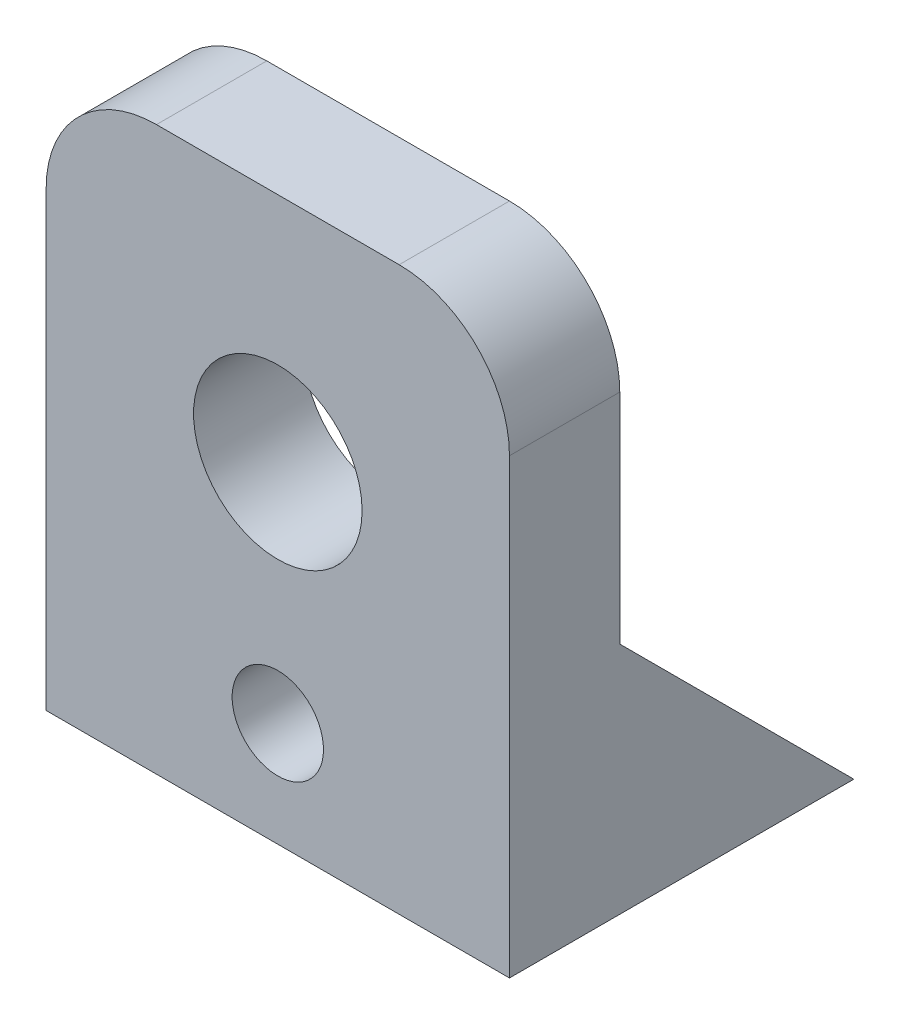
ISO-10303-21;
HEADER;
FILE_DESCRIPTION(('STEP AP214'),'2;1');
FILE_NAME('part.step','',(''),(''),'','','');
FILE_SCHEMA(('AUTOMOTIVE_DESIGN { 1 0 10303 214 1 1 1 1 }'));
ENDSEC;
DATA;
#1=APPLICATION_CONTEXT('core data for automotive mechanical design processes');
#2=APPLICATION_PROTOCOL_DEFINITION('international standard','automotive_design',2000,#1);
#3=PRODUCT_CONTEXT('',#1,'mechanical');
#4=PRODUCT('Part','Part','',(#3));
#5=PRODUCT_RELATED_PRODUCT_CATEGORY('part','',(#4));
#6=PRODUCT_DEFINITION_FORMATION('','',#4);
#7=PRODUCT_DEFINITION_CONTEXT('part definition',#1,'design');
#8=PRODUCT_DEFINITION('design','',#6,#7);
#9=PRODUCT_DEFINITION_SHAPE('','',#8);
#10=(LENGTH_UNIT() NAMED_UNIT(*) SI_UNIT(.MILLI.,.METRE.));
#11=(NAMED_UNIT(*) PLANE_ANGLE_UNIT() SI_UNIT($,.RADIAN.));
#12=(NAMED_UNIT(*) SI_UNIT($,.STERADIAN.) SOLID_ANGLE_UNIT());
#13=UNCERTAINTY_MEASURE_WITH_UNIT(LENGTH_MEASURE(1.E-05),#10,'distance_accuracy_value','');
#14=(GEOMETRIC_REPRESENTATION_CONTEXT(3) GLOBAL_UNCERTAINTY_ASSIGNED_CONTEXT((#13)) GLOBAL_UNIT_ASSIGNED_CONTEXT((#10,
#11,#12)) REPRESENTATION_CONTEXT('',''));
#15=CARTESIAN_POINT('',(0.,0.,0.));
#16=DIRECTION('',(0.,0.,1.));
#17=DIRECTION('',(1.,0.,0.));
#18=AXIS2_PLACEMENT_3D('',#15,#16,#17);
#19=CARTESIAN_POINT('',(-7.44489648097042,20.4806525942305,-10.));
#20=DIRECTION('',(0.,0.,1.));
#21=DIRECTION('',(1.,0.,0.));
#22=AXIS2_PLACEMENT_3D('',#19,#20,#21);
#23=PLANE('',#22);
#24=CARTESIAN_POINT('',(-18.4448964809706,-11.0193474057693,-10.));
#25=DIRECTION('',(0.,0.,1.));
#26=DIRECTION('',(1.,0.,0.));
#27=AXIS2_PLACEMENT_3D('',#24,#25,#26);
#28=CIRCLE('',#27,4.14);
#29=CARTESIAN_POINT('',(-14.3048964809706,-11.0193474057693,-10.));
#30=VERTEX_POINT('',#29);
#31=EDGE_CURVE('E126',#30,#30,#28,.T.);
#32=ORIENTED_EDGE('',*,*,#31,.T.);
#33=EDGE_LOOP('',(#32));
#34=FACE_BOUND('',#33,.T.);
#35=CARTESIAN_POINT('',(-18.4448964809706,9.48065259423065,-10.));
#36=DIRECTION('',(0.,0.,1.));
#37=DIRECTION('',(1.,0.,0.));
#38=AXIS2_PLACEMENT_3D('',#35,#36,#37);
#39=CIRCLE('',#38,7.64);
#40=CARTESIAN_POINT('',(-10.8048964809706,9.48065259423065,-10.));
#41=VERTEX_POINT('',#40);
#42=EDGE_CURVE('E120',#41,#41,#39,.T.);
#43=ORIENTED_EDGE('',*,*,#42,.T.);
#44=EDGE_LOOP('',(#43));
#45=FACE_BOUND('',#44,.T.);
#46=DIRECTION('',(1.,0.,0.));
#47=VECTOR('',#46,1.);
#48=CARTESIAN_POINT('',(-7.44489648097035,0.698211879724428,-10.));
#49=LINE('',#48,#47);
#50=CARTESIAN_POINT('',(-7.44489648097035,0.698211879724428,-10.));
#51=VERTEX_POINT('',#50);
#52=CARTESIAN_POINT('',(2.55510351902965,0.698211879724447,-10.));
#53=VERTEX_POINT('',#52);
#54=EDGE_CURVE('E97',#51,#53,#49,.T.);
#55=ORIENTED_EDGE('',*,*,#54,.F.);
#56=DIRECTION('',(0.,1.,0.));
#57=VECTOR('',#56,1.);
#58=CARTESIAN_POINT('',(-7.44489648097027,-20.5193474057695,-10.));
#59=LINE('',#58,#57);
#60=CARTESIAN_POINT('',(-7.44489648097031,-20.5193474057695,-10.));
#61=VERTEX_POINT('',#60);
#62=EDGE_CURVE('E56',#61,#51,#59,.T.);
#63=ORIENTED_EDGE('',*,*,#62,.F.);
#64=DIRECTION('',(1.,0.,0.));
#65=VECTOR('',#64,1.);
#66=CARTESIAN_POINT('',(-39.4448964809703,-20.5193474057695,-10.));
#67=LINE('',#66,#65);
#68=CARTESIAN_POINT('',(-39.4448964809703,-20.5193474057695,-10.));
#69=VERTEX_POINT('',#68);
#70=EDGE_CURVE('E132',#69,#61,#67,.T.);
#71=ORIENTED_EDGE('',*,*,#70,.F.);
#72=DIRECTION('',(0.,-1.,0.));
#73=VECTOR('',#72,1.);
#74=CARTESIAN_POINT('',(-39.4448964809704,20.4806525942305,-10.));
#75=LINE('',#74,#73);
#76=CARTESIAN_POINT('',(-39.4448964809704,20.4806525942305,-10.));
#77=VERTEX_POINT('',#76);
#78=EDGE_CURVE('E145',#77,#69,#75,.T.);
#79=ORIENTED_EDGE('',*,*,#78,.F.);
#80=CARTESIAN_POINT('',(-29.4448964809704,20.4806525942305,-10.));
#81=DIRECTION('',(0.,0.,1.));
#82=DIRECTION('',(-1.,0.,0.));
#83=AXIS2_PLACEMENT_3D('',#80,#81,#82);
#84=CIRCLE('',#83,10.);
#85=CARTESIAN_POINT('',(-29.4448964809704,30.4806525942305,-10.));
#86=VERTEX_POINT('',#85);
#87=EDGE_CURVE('E142',#86,#77,#84,.T.);
#88=ORIENTED_EDGE('',*,*,#87,.F.);
#89=DIRECTION('',(-1.,0.,0.));
#90=VECTOR('',#89,1.);
#91=CARTESIAN_POINT('',(-7.44489648097042,30.4806525942305,-10.));
#92=LINE('',#91,#90);
#93=CARTESIAN_POINT('',(-7.44489648097042,30.4806525942305,-10.));
#94=VERTEX_POINT('',#93);
#95=EDGE_CURVE('E139',#94,#86,#92,.T.);
#96=ORIENTED_EDGE('',*,*,#95,.F.);
#97=CARTESIAN_POINT('',(-7.44489648097042,20.4806525942305,-10.));
#98=DIRECTION('',(0.,0.,1.));
#99=DIRECTION('',(1.,0.,0.));
#100=AXIS2_PLACEMENT_3D('',#97,#98,#99);
#101=CIRCLE('',#100,10.);
#102=CARTESIAN_POINT('',(2.55510351902959,20.4806525942305,-10.));
#103=VERTEX_POINT('',#102);
#104=EDGE_CURVE('E136',#103,#94,#101,.T.);
#105=ORIENTED_EDGE('',*,*,#104,.F.);
#106=DIRECTION('',(0.,1.,0.));
#107=VECTOR('',#106,1.);
#108=CARTESIAN_POINT('',(2.55510351902973,-20.5193474057695,-10.));
#109=LINE('',#108,#107);
#110=EDGE_CURVE('E50',#53,#103,#109,.T.);
#111=ORIENTED_EDGE('',*,*,#110,.F.);
#112=EDGE_LOOP('',(#55,#63,#71,#79,#88,#96,#105,#111));
#113=FACE_BOUND('',#112,.T.);
#114=ADVANCED_FACE('F33',(#34,#45,#113),#23,.F.);
#115=CARTESIAN_POINT('',(-39.4448964809703,-20.5193474057695,-10.));
#116=DIRECTION('',(0.,-1.,0.));
#117=DIRECTION('',(0.,0.,-1.));
#118=AXIS2_PLACEMENT_3D('',#115,#116,#117);
#119=PLANE('',#118);
#120=DIRECTION('',(1.,0.,0.));
#121=VECTOR('',#120,1.);
#122=CARTESIAN_POINT('',(-39.4448964809703,-20.5193474057695,0.));
#123=LINE('',#122,#121);
#124=CARTESIAN_POINT('',(-39.4448964809703,-20.5193474057695,0.));
#125=VERTEX_POINT('',#124);
#126=CARTESIAN_POINT('',(2.55510351902973,-20.5193474057695,0.));
#127=VERTEX_POINT('',#126);
#128=EDGE_CURVE('E129',#125,#127,#123,.T.);
#129=ORIENTED_EDGE('',*,*,#128,.F.);
#130=DIRECTION('',(0.,0.,1.));
#131=VECTOR('',#130,1.);
#132=CARTESIAN_POINT('',(-39.4448964809703,-20.5193474057695,-10.));
#133=LINE('',#132,#131);
#134=EDGE_CURVE('E11',#69,#125,#133,.T.);
#135=ORIENTED_EDGE('',*,*,#134,.F.);
#136=ORIENTED_EDGE('',*,*,#70,.T.);
#137=DIRECTION('',(0.,0.,1.));
#138=VECTOR('',#137,1.);
#139=CARTESIAN_POINT('',(-7.44489648097027,-20.5193474057695,-31.2175592854942));
#140=LINE('',#139,#138);
#141=CARTESIAN_POINT('',(-7.44489648097027,-20.5193474057695,-31.2175592854942));
#142=VERTEX_POINT('',#141);
#143=EDGE_CURVE('E111',#142,#61,#140,.T.);
#144=ORIENTED_EDGE('',*,*,#143,.F.);
#145=DIRECTION('',(1.,0.,0.));
#146=VECTOR('',#145,1.);
#147=CARTESIAN_POINT('',(-7.44489648097027,-20.5193474057695,-31.2175592854942));
#148=LINE('',#147,#146);
#149=CARTESIAN_POINT('',(2.55510351902973,-20.5193474057695,-31.2175592854942));
#150=VERTEX_POINT('',#149);
#151=EDGE_CURVE('E102',#142,#150,#148,.T.);
#152=ORIENTED_EDGE('',*,*,#151,.T.);
#153=DIRECTION('',(0.,0.,1.));
#154=VECTOR('',#153,1.);
#155=CARTESIAN_POINT('',(2.55510351902973,-20.5193474057695,-10.));
#156=LINE('',#155,#154);
#157=EDGE_CURVE('E37',#150,#127,#156,.T.);
#158=ORIENTED_EDGE('',*,*,#157,.T.);
#159=EDGE_LOOP('',(#129,#135,#136,#144,#152,#158));
#160=FACE_BOUND('',#159,.T.);
#161=ADVANCED_FACE('F35',(#160),#119,.T.);
#162=CARTESIAN_POINT('',(-39.4448964809704,20.4806525942305,-10.));
#163=DIRECTION('',(-1.,0.,0.));
#164=DIRECTION('',(0.,-1.,0.));
#165=AXIS2_PLACEMENT_3D('',#162,#163,#164);
#166=PLANE('',#165);
#167=DIRECTION('',(0.,-1.,0.));
#168=VECTOR('',#167,1.);
#169=CARTESIAN_POINT('',(-39.4448964809704,20.4806525942305,0.));
#170=LINE('',#169,#168);
#171=CARTESIAN_POINT('',(-39.4448964809704,20.4806525942305,0.));
#172=VERTEX_POINT('',#171);
#173=EDGE_CURVE('E134',#172,#125,#170,.T.);
#174=ORIENTED_EDGE('',*,*,#173,.F.);
#175=DIRECTION('',(0.,0.,1.));
#176=VECTOR('',#175,1.);
#177=CARTESIAN_POINT('',(-39.4448964809704,20.4806525942305,-10.));
#178=LINE('',#177,#176);
#179=EDGE_CURVE('E42',#77,#172,#178,.T.);
#180=ORIENTED_EDGE('',*,*,#179,.F.);
#181=ORIENTED_EDGE('',*,*,#78,.T.);
#182=ORIENTED_EDGE('',*,*,#134,.T.);
#183=EDGE_LOOP('',(#174,#180,#181,#182));
#184=FACE_BOUND('',#183,.T.);
#185=ADVANCED_FACE('F181',(#184),#166,.T.);
#186=CARTESIAN_POINT('',(-29.4448964809704,20.4806525942305,-10.));
#187=DIRECTION('',(0.,0.,1.));
#188=DIRECTION('',(1.,0.,0.));
#189=AXIS2_PLACEMENT_3D('',#186,#187,#188);
#190=CYLINDRICAL_SURFACE('',#189,10.);
#191=CARTESIAN_POINT('',(-29.4448964809704,20.4806525942305,0.));
#192=DIRECTION('',(0.,0.,1.));
#193=DIRECTION('',(-1.,0.,0.));
#194=AXIS2_PLACEMENT_3D('',#191,#192,#193);
#195=CIRCLE('',#194,10.);
#196=CARTESIAN_POINT('',(-29.4448964809704,30.4806525942305,0.));
#197=VERTEX_POINT('',#196);
#198=EDGE_CURVE('E159',#197,#172,#195,.T.);
#199=ORIENTED_EDGE('',*,*,#198,.F.);
#200=DIRECTION('',(0.,0.,1.));
#201=VECTOR('',#200,1.);
#202=CARTESIAN_POINT('',(-29.4448964809704,30.4806525942305,-10.));
#203=LINE('',#202,#201);
#204=EDGE_CURVE('E165',#86,#197,#203,.T.);
#205=ORIENTED_EDGE('',*,*,#204,.F.);
#206=ORIENTED_EDGE('',*,*,#87,.T.);
#207=ORIENTED_EDGE('',*,*,#179,.T.);
#208=EDGE_LOOP('',(#199,#205,#206,#207));
#209=FACE_BOUND('',#208,.T.);
#210=ADVANCED_FACE('F198',(#209),#190,.T.);
#211=CARTESIAN_POINT('',(-7.44489648097042,30.4806525942305,-10.));
#212=DIRECTION('',(0.,1.,0.));
#213=DIRECTION('',(0.,0.,1.));
#214=AXIS2_PLACEMENT_3D('',#211,#212,#213);
#215=PLANE('',#214);
#216=DIRECTION('',(-1.,0.,0.));
#217=VECTOR('',#216,1.);
#218=CARTESIAN_POINT('',(-7.44489648097042,30.4806525942305,0.));
#219=LINE('',#218,#217);
#220=CARTESIAN_POINT('',(-7.44489648097042,30.4806525942305,0.));
#221=VERTEX_POINT('',#220);
#222=EDGE_CURVE('E156',#221,#197,#219,.T.);
#223=ORIENTED_EDGE('',*,*,#222,.F.);
#224=DIRECTION('',(0.,0.,1.));
#225=VECTOR('',#224,1.);
#226=CARTESIAN_POINT('',(-7.44489648097042,30.4806525942305,-10.));
#227=LINE('',#226,#225);
#228=EDGE_CURVE('E167',#94,#221,#227,.T.);
#229=ORIENTED_EDGE('',*,*,#228,.F.);
#230=ORIENTED_EDGE('',*,*,#95,.T.);
#231=ORIENTED_EDGE('',*,*,#204,.T.);
#232=EDGE_LOOP('',(#223,#229,#230,#231));
#233=FACE_BOUND('',#232,.T.);
#234=ADVANCED_FACE('F188',(#233),#215,.T.);
#235=CARTESIAN_POINT('',(-7.44489648097042,20.4806525942305,-10.));
#236=DIRECTION('',(0.,0.,1.));
#237=DIRECTION('',(1.,0.,0.));
#238=AXIS2_PLACEMENT_3D('',#235,#236,#237);
#239=CYLINDRICAL_SURFACE('',#238,10.);
#240=CARTESIAN_POINT('',(-7.44489648097042,20.4806525942305,0.));
#241=DIRECTION('',(0.,0.,1.));
#242=DIRECTION('',(1.,0.,0.));
#243=AXIS2_PLACEMENT_3D('',#240,#241,#242);
#244=CIRCLE('',#243,10.);
#245=CARTESIAN_POINT('',(2.55510351902959,20.4806525942305,0.));
#246=VERTEX_POINT('',#245);
#247=EDGE_CURVE('E153',#246,#221,#244,.T.);
#248=ORIENTED_EDGE('',*,*,#247,.F.);
#249=DIRECTION('',(0.,0.,1.));
#250=VECTOR('',#249,1.);
#251=CARTESIAN_POINT('',(2.55510351902959,20.4806525942305,-10.));
#252=LINE('',#251,#250);
#253=EDGE_CURVE('E168',#103,#246,#252,.T.);
#254=ORIENTED_EDGE('',*,*,#253,.F.);
#255=ORIENTED_EDGE('',*,*,#104,.T.);
#256=ORIENTED_EDGE('',*,*,#228,.T.);
#257=EDGE_LOOP('',(#248,#254,#255,#256));
#258=FACE_BOUND('',#257,.T.);
#259=ADVANCED_FACE('F190',(#258),#239,.T.);
#260=CARTESIAN_POINT('',(2.55510351902973,-20.5193474057695,-10.));
#261=DIRECTION('',(1.,0.,0.));
#262=DIRECTION('',(0.,1.,0.));
#263=AXIS2_PLACEMENT_3D('',#260,#261,#262);
#264=PLANE('',#263);
#265=DIRECTION('',(0.,1.,0.));
#266=VECTOR('',#265,1.);
#267=CARTESIAN_POINT('',(2.55510351902973,-20.5193474057695,0.));
#268=LINE('',#267,#266);
#269=EDGE_CURVE('E150',#127,#246,#268,.T.);
#270=ORIENTED_EDGE('',*,*,#269,.F.);
#271=ORIENTED_EDGE('',*,*,#157,.F.);
#272=DIRECTION('',(0.,-0.707106781186544,-0.707106781186551));
#273=VECTOR('',#272,1.);
#274=CARTESIAN_POINT('',(2.55510351902965,0.698211879724462,-10.));
#275=LINE('',#274,#273);
#276=EDGE_CURVE('E114',#53,#150,#275,.T.);
#277=ORIENTED_EDGE('',*,*,#276,.F.);
#278=ORIENTED_EDGE('',*,*,#110,.T.);
#279=ORIENTED_EDGE('',*,*,#253,.T.);
#280=EDGE_LOOP('',(#270,#271,#277,#278,#279));
#281=FACE_BOUND('',#280,.T.);
#282=ADVANCED_FACE('F175',(#281),#264,.T.);
#283=CARTESIAN_POINT('',(-7.44489648097042,20.4806525942305,0.));
#284=DIRECTION('',(0.,0.,1.));
#285=DIRECTION('',(1.,0.,0.));
#286=AXIS2_PLACEMENT_3D('',#283,#284,#285);
#287=PLANE('',#286);
#288=CARTESIAN_POINT('',(-18.4448964809706,9.48065259423065,0.));
#289=DIRECTION('',(0.,0.,1.));
#290=DIRECTION('',(1.,0.,0.));
#291=AXIS2_PLACEMENT_3D('',#288,#289,#290);
#292=CIRCLE('',#291,7.64);
#293=CARTESIAN_POINT('',(-10.8048964809706,9.48065259423065,0.));
#294=VERTEX_POINT('',#293);
#295=EDGE_CURVE('E101',#294,#294,#292,.T.);
#296=ORIENTED_EDGE('',*,*,#295,.F.);
#297=EDGE_LOOP('',(#296));
#298=FACE_BOUND('',#297,.T.);
#299=CARTESIAN_POINT('',(-18.4448964809706,-11.0193474057693,0.));
#300=DIRECTION('',(0.,0.,1.));
#301=DIRECTION('',(1.,0.,0.));
#302=AXIS2_PLACEMENT_3D('',#299,#300,#301);
#303=CIRCLE('',#302,4.14);
#304=CARTESIAN_POINT('',(-14.3048964809706,-11.0193474057693,0.));
#305=VERTEX_POINT('',#304);
#306=EDGE_CURVE('E123',#305,#305,#303,.T.);
#307=ORIENTED_EDGE('',*,*,#306,.F.);
#308=EDGE_LOOP('',(#307));
#309=FACE_BOUND('',#308,.T.);
#310=ORIENTED_EDGE('',*,*,#128,.T.);
#311=ORIENTED_EDGE('',*,*,#269,.T.);
#312=ORIENTED_EDGE('',*,*,#247,.T.);
#313=ORIENTED_EDGE('',*,*,#222,.T.);
#314=ORIENTED_EDGE('',*,*,#198,.T.);
#315=ORIENTED_EDGE('',*,*,#173,.T.);
#316=EDGE_LOOP('',(#310,#311,#312,#313,#314,#315));
#317=FACE_BOUND('',#316,.T.);
#318=ADVANCED_FACE('F177',(#298,#309,#317),#287,.T.);
#319=CARTESIAN_POINT('',(-18.4448964809706,-11.0193474057693,-10.));
#320=DIRECTION('',(0.,0.,1.));
#321=DIRECTION('',(1.,0.,0.));
#322=AXIS2_PLACEMENT_3D('',#319,#320,#321);
#323=CYLINDRICAL_SURFACE('',#322,4.14);
#324=ORIENTED_EDGE('',*,*,#31,.F.);
#325=EDGE_LOOP('',(#324));
#326=FACE_BOUND('',#325,.T.);
#327=ORIENTED_EDGE('',*,*,#306,.T.);
#328=EDGE_LOOP('',(#327));
#329=FACE_BOUND('',#328,.T.);
#330=ADVANCED_FACE('F211',(#326,#329),#323,.F.);
#331=CARTESIAN_POINT('',(-18.4448964809706,9.48065259423065,-10.));
#332=DIRECTION('',(0.,0.,1.));
#333=DIRECTION('',(1.,0.,0.));
#334=AXIS2_PLACEMENT_3D('',#331,#332,#333);
#335=CYLINDRICAL_SURFACE('',#334,7.64);
#336=ORIENTED_EDGE('',*,*,#42,.F.);
#337=EDGE_LOOP('',(#336));
#338=FACE_BOUND('',#337,.T.);
#339=ORIENTED_EDGE('',*,*,#295,.T.);
#340=EDGE_LOOP('',(#339));
#341=FACE_BOUND('',#340,.T.);
#342=ADVANCED_FACE('F245',(#338,#341),#335,.F.);
#343=CARTESIAN_POINT('',(-7.44489648097035,0.698211879724428,-10.));
#344=DIRECTION('',(0.,-0.707106781186551,0.707106781186544));
#345=DIRECTION('',(0.,-0.707106781186544,-0.707106781186551));
#346=AXIS2_PLACEMENT_3D('',#343,#344,#345);
#347=PLANE('',#346);
#348=ORIENTED_EDGE('',*,*,#276,.T.);
#349=ORIENTED_EDGE('',*,*,#151,.F.);
#350=DIRECTION('',(0.,-0.707106781186544,-0.707106781186551));
#351=VECTOR('',#350,1.);
#352=CARTESIAN_POINT('',(-7.44489648097035,0.698211879724428,-10.));
#353=LINE('',#352,#351);
#354=EDGE_CURVE('E105',#51,#142,#353,.T.);
#355=ORIENTED_EDGE('',*,*,#354,.F.);
#356=ORIENTED_EDGE('',*,*,#54,.T.);
#357=EDGE_LOOP('',(#348,#349,#355,#356));
#358=FACE_BOUND('',#357,.T.);
#359=ADVANCED_FACE('F106',(#358),#347,.F.);
#360=CARTESIAN_POINT('',(-7.44489648097034,0.,0.));
#361=DIRECTION('',(1.,0.,0.));
#362=DIRECTION('',(0.,1.,0.));
#363=AXIS2_PLACEMENT_3D('',#360,#361,#362);
#364=PLANE('',#363);
#365=ORIENTED_EDGE('',*,*,#62,.T.);
#366=ORIENTED_EDGE('',*,*,#354,.T.);
#367=ORIENTED_EDGE('',*,*,#143,.T.);
#368=EDGE_LOOP('',(#365,#366,#367));
#369=FACE_BOUND('',#368,.T.);
#370=ADVANCED_FACE('F113',(#369),#364,.F.);
#371=CLOSED_SHELL('',(#114,#161,#185,#210,#234,#259,#282,#318,#330,#342,#359,#370));
#372=MANIFOLD_SOLID_BREP('B2',#371);
#373=ADVANCED_BREP_SHAPE_REPRESENTATION('',(#18,#372),#14);
#374=SHAPE_DEFINITION_REPRESENTATION(#9,#373);
ENDSEC;
END-ISO-10303-21;
